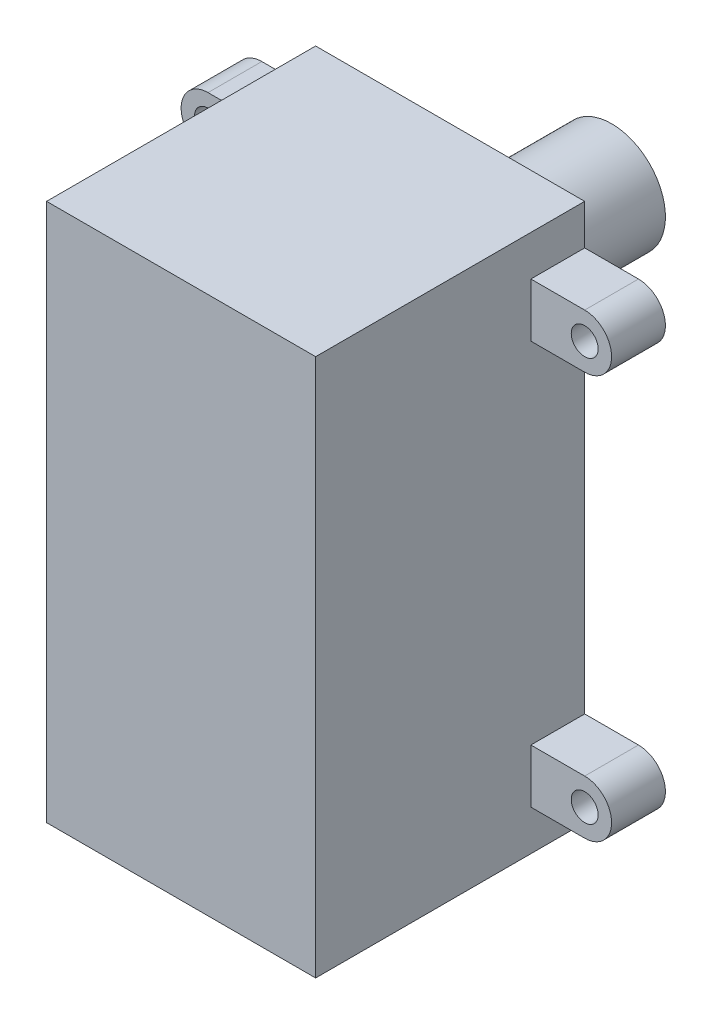
ISO-10303-21;
HEADER;
FILE_DESCRIPTION(('STEP AP214'),'2;1');
FILE_NAME('part.step','',(''),(''),'','','');
FILE_SCHEMA(('AUTOMOTIVE_DESIGN { 1 0 10303 214 1 1 1 1 }'));
ENDSEC;
DATA;
#1=APPLICATION_CONTEXT('core data for automotive mechanical design processes');
#2=APPLICATION_PROTOCOL_DEFINITION('international standard','automotive_design',2000,#1);
#3=PRODUCT_CONTEXT('',#1,'mechanical');
#4=PRODUCT('Part','Part','',(#3));
#5=PRODUCT_RELATED_PRODUCT_CATEGORY('part','',(#4));
#6=PRODUCT_DEFINITION_FORMATION('','',#4);
#7=PRODUCT_DEFINITION_CONTEXT('part definition',#1,'design');
#8=PRODUCT_DEFINITION('design','',#6,#7);
#9=PRODUCT_DEFINITION_SHAPE('','',#8);
#10=(LENGTH_UNIT() NAMED_UNIT(*) SI_UNIT(.MILLI.,.METRE.));
#11=(NAMED_UNIT(*) PLANE_ANGLE_UNIT() SI_UNIT($,.RADIAN.));
#12=(NAMED_UNIT(*) SI_UNIT($,.STERADIAN.) SOLID_ANGLE_UNIT());
#13=UNCERTAINTY_MEASURE_WITH_UNIT(LENGTH_MEASURE(1.E-05),#10,'distance_accuracy_value','');
#14=(GEOMETRIC_REPRESENTATION_CONTEXT(3) GLOBAL_UNCERTAINTY_ASSIGNED_CONTEXT((#13)) GLOBAL_UNIT_ASSIGNED_CONTEXT((#10,
#11,#12)) REPRESENTATION_CONTEXT('',''));
#15=CARTESIAN_POINT('',(0.,0.,0.));
#16=DIRECTION('',(0.,0.,1.));
#17=DIRECTION('',(1.,0.,0.));
#18=AXIS2_PLACEMENT_3D('',#15,#16,#17);
#19=CARTESIAN_POINT('',(-3.29383886255924,-5.,50.));
#20=DIRECTION('',(1.,0.,0.));
#21=DIRECTION('',(0.,0.,-1.));
#22=AXIS2_PLACEMENT_3D('',#19,#20,#21);
#23=PLANE('',#22);
#24=DIRECTION('',(0.,0.,-1.));
#25=VECTOR('',#24,1.);
#26=CARTESIAN_POINT('',(-3.29383886255924,87.5,10.));
#27=LINE('',#26,#25);
#28=CARTESIAN_POINT('',(-3.29383886255924,87.5,10.));
#29=VERTEX_POINT('',#28);
#30=CARTESIAN_POINT('',(-3.29383886255924,87.5,0.));
#31=VERTEX_POINT('',#30);
#32=EDGE_CURVE('E372',#29,#31,#27,.T.);
#33=ORIENTED_EDGE('',*,*,#32,.F.);
#34=DIRECTION('',(0.,-1.,0.));
#35=VECTOR('',#34,1.);
#36=CARTESIAN_POINT('',(-3.29383886255924,77.5,10.));
#37=LINE('',#36,#35);
#38=CARTESIAN_POINT('',(-3.29383886255924,77.5,10.));
#39=VERTEX_POINT('',#38);
#40=EDGE_CURVE('E214',#29,#39,#37,.T.);
#41=ORIENTED_EDGE('',*,*,#40,.T.);
#42=DIRECTION('',(0.,0.,-1.));
#43=VECTOR('',#42,1.);
#44=CARTESIAN_POINT('',(-3.29383886255924,77.5,10.));
#45=LINE('',#44,#43);
#46=CARTESIAN_POINT('',(-3.29383886255924,77.5,0.));
#47=VERTEX_POINT('',#46);
#48=EDGE_CURVE('E189',#39,#47,#45,.T.);
#49=ORIENTED_EDGE('',*,*,#48,.T.);
#50=DIRECTION('',(0.,-1.,0.));
#51=VECTOR('',#50,1.);
#52=CARTESIAN_POINT('',(-3.29383886255924,-5.,0.));
#53=LINE('',#52,#51);
#54=CARTESIAN_POINT('',(-3.29383886255924,12.5,0.));
#55=VERTEX_POINT('',#54);
#56=EDGE_CURVE('E206',#47,#55,#53,.T.);
#57=ORIENTED_EDGE('',*,*,#56,.T.);
#58=DIRECTION('',(0.,0.,-1.));
#59=VECTOR('',#58,1.);
#60=CARTESIAN_POINT('',(-3.29383886255924,12.5,10.));
#61=LINE('',#60,#59);
#62=CARTESIAN_POINT('',(-3.29383886255924,12.5,10.));
#63=VERTEX_POINT('',#62);
#64=EDGE_CURVE('E325',#63,#55,#61,.T.);
#65=ORIENTED_EDGE('',*,*,#64,.F.);
#66=DIRECTION('',(0.,-1.,0.));
#67=VECTOR('',#66,1.);
#68=CARTESIAN_POINT('',(-3.29383886255924,12.5,10.));
#69=LINE('',#68,#67);
#70=CARTESIAN_POINT('',(-3.29383886255924,2.5,10.));
#71=VERTEX_POINT('',#70);
#72=EDGE_CURVE('E301',#63,#71,#69,.T.);
#73=ORIENTED_EDGE('',*,*,#72,.T.);
#74=DIRECTION('',(0.,0.,-1.));
#75=VECTOR('',#74,1.);
#76=CARTESIAN_POINT('',(-3.29383886255924,2.5,10.));
#77=LINE('',#76,#75);
#78=CARTESIAN_POINT('',(-3.29383886255924,2.5,0.));
#79=VERTEX_POINT('',#78);
#80=EDGE_CURVE('E316',#71,#79,#77,.T.);
#81=ORIENTED_EDGE('',*,*,#80,.T.);
#82=CARTESIAN_POINT('',(-3.29383886255924,-5.,0.));
#83=VERTEX_POINT('',#82);
#84=EDGE_CURVE('E341',#79,#83,#53,.T.);
#85=ORIENTED_EDGE('',*,*,#84,.T.);
#86=DIRECTION('',(0.,0.,-1.));
#87=VECTOR('',#86,1.);
#88=CARTESIAN_POINT('',(-3.29383886255924,-5.,50.));
#89=LINE('',#88,#87);
#90=CARTESIAN_POINT('',(-3.29383886255924,-5.,50.));
#91=VERTEX_POINT('',#90);
#92=EDGE_CURVE('E360',#91,#83,#89,.T.);
#93=ORIENTED_EDGE('',*,*,#92,.F.);
#94=DIRECTION('',(0.,-1.,0.));
#95=VECTOR('',#94,1.);
#96=CARTESIAN_POINT('',(-3.29383886255924,-5.,50.));
#97=LINE('',#96,#95);
#98=CARTESIAN_POINT('',(-3.29383886255924,95.,50.));
#99=VERTEX_POINT('',#98);
#100=EDGE_CURVE('E334',#99,#91,#97,.T.);
#101=ORIENTED_EDGE('',*,*,#100,.F.);
#102=DIRECTION('',(0.,0.,-1.));
#103=VECTOR('',#102,1.);
#104=CARTESIAN_POINT('',(-3.29383886255924,95.,50.));
#105=LINE('',#104,#103);
#106=CARTESIAN_POINT('',(-3.29383886255924,95.,0.));
#107=VERTEX_POINT('',#106);
#108=EDGE_CURVE('E50',#99,#107,#105,.T.);
#109=ORIENTED_EDGE('',*,*,#108,.T.);
#110=EDGE_CURVE('E342',#107,#31,#53,.T.);
#111=ORIENTED_EDGE('',*,*,#110,.T.);
#112=EDGE_LOOP('',(#33,#41,#49,#57,#65,#73,#81,#85,#93,#101,#109,#111));
#113=FACE_BOUND('',#112,.T.);
#114=ADVANCED_FACE('F43',(#113),#23,.F.);
#115=CARTESIAN_POINT('',(46.7061611374408,-5.,50.));
#116=DIRECTION('',(-1.,0.,0.));
#117=DIRECTION('',(0.,0.,1.));
#118=AXIS2_PLACEMENT_3D('',#115,#116,#117);
#119=PLANE('',#118);
#120=DIRECTION('',(0.,0.,-1.));
#121=VECTOR('',#120,1.);
#122=CARTESIAN_POINT('',(46.7061611374408,2.5,10.));
#123=LINE('',#122,#121);
#124=CARTESIAN_POINT('',(46.7061611374408,2.5,10.));
#125=VERTEX_POINT('',#124);
#126=CARTESIAN_POINT('',(46.7061611374408,2.5,0.));
#127=VERTEX_POINT('',#126);
#128=EDGE_CURVE('E264',#125,#127,#123,.T.);
#129=ORIENTED_EDGE('',*,*,#128,.F.);
#130=DIRECTION('',(0.,1.,0.));
#131=VECTOR('',#130,1.);
#132=CARTESIAN_POINT('',(46.7061611374408,12.5,10.));
#133=LINE('',#132,#131);
#134=CARTESIAN_POINT('',(46.7061611374408,12.5,10.));
#135=VERTEX_POINT('',#134);
#136=EDGE_CURVE('E288',#125,#135,#133,.T.);
#137=ORIENTED_EDGE('',*,*,#136,.T.);
#138=DIRECTION('',(0.,0.,-1.));
#139=VECTOR('',#138,1.);
#140=CARTESIAN_POINT('',(46.7061611374408,12.5,10.));
#141=LINE('',#140,#139);
#142=CARTESIAN_POINT('',(46.7061611374408,12.5,0.));
#143=VERTEX_POINT('',#142);
#144=EDGE_CURVE('E270',#135,#143,#141,.T.);
#145=ORIENTED_EDGE('',*,*,#144,.T.);
#146=DIRECTION('',(0.,1.,0.));
#147=VECTOR('',#146,1.);
#148=CARTESIAN_POINT('',(46.7061611374408,-5.,0.));
#149=LINE('',#148,#147);
#150=CARTESIAN_POINT('',(46.7061611374408,77.5,0.));
#151=VERTEX_POINT('',#150);
#152=EDGE_CURVE('E354',#143,#151,#149,.T.);
#153=ORIENTED_EDGE('',*,*,#152,.T.);
#154=DIRECTION('',(0.,0.,-1.));
#155=VECTOR('',#154,1.);
#156=CARTESIAN_POINT('',(46.7061611374408,77.5,10.));
#157=LINE('',#156,#155);
#158=CARTESIAN_POINT('',(46.7061611374408,77.5,10.));
#159=VERTEX_POINT('',#158);
#160=EDGE_CURVE('E226',#159,#151,#157,.T.);
#161=ORIENTED_EDGE('',*,*,#160,.F.);
#162=DIRECTION('',(0.,1.,0.));
#163=VECTOR('',#162,1.);
#164=CARTESIAN_POINT('',(46.7061611374408,77.5,10.));
#165=LINE('',#164,#163);
#166=CARTESIAN_POINT('',(46.7061611374408,87.5,10.));
#167=VERTEX_POINT('',#166);
#168=EDGE_CURVE('E249',#159,#167,#165,.T.);
#169=ORIENTED_EDGE('',*,*,#168,.T.);
#170=DIRECTION('',(0.,0.,-1.));
#171=VECTOR('',#170,1.);
#172=CARTESIAN_POINT('',(46.7061611374408,87.5,10.));
#173=LINE('',#172,#171);
#174=CARTESIAN_POINT('',(46.7061611374408,87.5,0.));
#175=VERTEX_POINT('',#174);
#176=EDGE_CURVE('E233',#167,#175,#173,.T.);
#177=ORIENTED_EDGE('',*,*,#176,.T.);
#178=CARTESIAN_POINT('',(46.7061611374408,95.,0.));
#179=VERTEX_POINT('',#178);
#180=EDGE_CURVE('E349',#175,#179,#149,.T.);
#181=ORIENTED_EDGE('',*,*,#180,.T.);
#182=DIRECTION('',(0.,0.,-1.));
#183=VECTOR('',#182,1.);
#184=CARTESIAN_POINT('',(46.7061611374408,95.,50.));
#185=LINE('',#184,#183);
#186=CARTESIAN_POINT('',(46.7061611374408,95.,50.));
#187=VERTEX_POINT('',#186);
#188=EDGE_CURVE('E338',#187,#179,#185,.T.);
#189=ORIENTED_EDGE('',*,*,#188,.F.);
#190=DIRECTION('',(0.,1.,0.));
#191=VECTOR('',#190,1.);
#192=CARTESIAN_POINT('',(46.7061611374408,-5.,50.));
#193=LINE('',#192,#191);
#194=CARTESIAN_POINT('',(46.7061611374408,-5.,50.));
#195=VERTEX_POINT('',#194);
#196=EDGE_CURVE('E340',#195,#187,#193,.T.);
#197=ORIENTED_EDGE('',*,*,#196,.F.);
#198=DIRECTION('',(0.,0.,-1.));
#199=VECTOR('',#198,1.);
#200=CARTESIAN_POINT('',(46.7061611374408,-5.,50.));
#201=LINE('',#200,#199);
#202=CARTESIAN_POINT('',(46.7061611374408,-5.,0.));
#203=VERTEX_POINT('',#202);
#204=EDGE_CURVE('E353',#195,#203,#201,.T.);
#205=ORIENTED_EDGE('',*,*,#204,.T.);
#206=EDGE_CURVE('E331',#203,#127,#149,.T.);
#207=ORIENTED_EDGE('',*,*,#206,.T.);
#208=EDGE_LOOP('',(#129,#137,#145,#153,#161,#169,#177,#181,#189,#197,#205,#207));
#209=FACE_BOUND('',#208,.T.);
#210=ADVANCED_FACE('F410',(#209),#119,.F.);
#211=CARTESIAN_POINT('',(46.7061611374408,95.,50.));
#212=DIRECTION('',(0.,-1.,0.));
#213=DIRECTION('',(0.,0.,-1.));
#214=AXIS2_PLACEMENT_3D('',#211,#212,#213);
#215=PLANE('',#214);
#216=DIRECTION('',(-1.,0.,0.));
#217=VECTOR('',#216,1.);
#218=CARTESIAN_POINT('',(46.7061611374408,95.,0.));
#219=LINE('',#218,#217);
#220=EDGE_CURVE('E322',#179,#107,#219,.T.);
#221=ORIENTED_EDGE('',*,*,#220,.T.);
#222=ORIENTED_EDGE('',*,*,#108,.F.);
#223=DIRECTION('',(-1.,0.,0.));
#224=VECTOR('',#223,1.);
#225=CARTESIAN_POINT('',(46.7061611374408,95.,50.));
#226=LINE('',#225,#224);
#227=EDGE_CURVE('E329',#187,#99,#226,.T.);
#228=ORIENTED_EDGE('',*,*,#227,.F.);
#229=ORIENTED_EDGE('',*,*,#188,.T.);
#230=EDGE_LOOP('',(#221,#222,#228,#229));
#231=FACE_BOUND('',#230,.T.);
#232=ADVANCED_FACE('F44',(#231),#215,.F.);
#233=CARTESIAN_POINT('',(46.7061611374408,-5.,50.));
#234=DIRECTION('',(0.,1.,0.));
#235=DIRECTION('',(0.,0.,1.));
#236=AXIS2_PLACEMENT_3D('',#233,#234,#235);
#237=PLANE('',#236);
#238=DIRECTION('',(1.,0.,0.));
#239=VECTOR('',#238,1.);
#240=CARTESIAN_POINT('',(46.7061611374408,-5.,0.));
#241=LINE('',#240,#239);
#242=EDGE_CURVE('E350',#83,#203,#241,.T.);
#243=ORIENTED_EDGE('',*,*,#242,.T.);
#244=ORIENTED_EDGE('',*,*,#204,.F.);
#245=DIRECTION('',(1.,0.,0.));
#246=VECTOR('',#245,1.);
#247=CARTESIAN_POINT('',(46.7061611374408,-5.,50.));
#248=LINE('',#247,#246);
#249=EDGE_CURVE('E337',#91,#195,#248,.T.);
#250=ORIENTED_EDGE('',*,*,#249,.F.);
#251=ORIENTED_EDGE('',*,*,#92,.T.);
#252=EDGE_LOOP('',(#243,#244,#250,#251));
#253=FACE_BOUND('',#252,.T.);
#254=ADVANCED_FACE('F401',(#253),#237,.F.);
#255=CARTESIAN_POINT('',(0.,0.,50.));
#256=DIRECTION('',(0.,0.,-1.));
#257=DIRECTION('',(-1.,0.,0.));
#258=AXIS2_PLACEMENT_3D('',#255,#256,#257);
#259=PLANE('',#258);
#260=ORIENTED_EDGE('',*,*,#227,.T.);
#261=ORIENTED_EDGE('',*,*,#100,.T.);
#262=ORIENTED_EDGE('',*,*,#249,.T.);
#263=ORIENTED_EDGE('',*,*,#196,.T.);
#264=EDGE_LOOP('',(#260,#261,#262,#263));
#265=FACE_BOUND('',#264,.T.);
#266=ADVANCED_FACE('F394',(#265),#259,.F.);
#267=CARTESIAN_POINT('',(0.,0.,0.));
#268=DIRECTION('',(0.,0.,-1.));
#269=DIRECTION('',(-1.,0.,0.));
#270=AXIS2_PLACEMENT_3D('',#267,#268,#269);
#271=PLANE('',#270);
#272=CARTESIAN_POINT('',(21.7061611374408,70.,0.));
#273=DIRECTION('',(0.,0.,-1.));
#274=DIRECTION('',(-1.,0.,0.));
#275=AXIS2_PLACEMENT_3D('',#272,#273,#274);
#276=CIRCLE('',#275,10.);
#277=CARTESIAN_POINT('',(11.7061611374408,70.,0.));
#278=VERTEX_POINT('',#277);
#279=EDGE_CURVE('E11',#278,#278,#276,.T.);
#280=ORIENTED_EDGE('',*,*,#279,.F.);
#281=EDGE_LOOP('',(#280));
#282=FACE_BOUND('',#281,.T.);
#283=ORIENTED_EDGE('',*,*,#220,.F.);
#284=ORIENTED_EDGE('',*,*,#180,.F.);
#285=DIRECTION('',(1.,0.,0.));
#286=VECTOR('',#285,1.);
#287=CARTESIAN_POINT('',(46.7061611374408,87.5,0.));
#288=LINE('',#287,#286);
#289=CARTESIAN_POINT('',(56.7061611374408,87.5,0.));
#290=VERTEX_POINT('',#289);
#291=EDGE_CURVE('E240',#175,#290,#288,.T.);
#292=ORIENTED_EDGE('',*,*,#291,.T.);
#293=CARTESIAN_POINT('',(56.7061611374408,82.5,0.));
#294=DIRECTION('',(0.,0.,-1.));
#295=DIRECTION('',(-1.,0.,0.));
#296=AXIS2_PLACEMENT_3D('',#293,#294,#295);
#297=CIRCLE('',#296,5.);
#298=CARTESIAN_POINT('',(56.7061611374408,77.5,0.));
#299=VERTEX_POINT('',#298);
#300=EDGE_CURVE('E241',#290,#299,#297,.T.);
#301=ORIENTED_EDGE('',*,*,#300,.T.);
#302=DIRECTION('',(-1.,0.,0.));
#303=VECTOR('',#302,1.);
#304=CARTESIAN_POINT('',(56.7061611374408,77.5,0.));
#305=LINE('',#304,#303);
#306=EDGE_CURVE('E238',#299,#151,#305,.T.);
#307=ORIENTED_EDGE('',*,*,#306,.T.);
#308=ORIENTED_EDGE('',*,*,#152,.F.);
#309=DIRECTION('',(1.,0.,0.));
#310=VECTOR('',#309,1.);
#311=CARTESIAN_POINT('',(56.7061611374408,12.5,0.));
#312=LINE('',#311,#310);
#313=CARTESIAN_POINT('',(56.7061611374408,12.5,0.));
#314=VERTEX_POINT('',#313);
#315=EDGE_CURVE('E272',#143,#314,#312,.T.);
#316=ORIENTED_EDGE('',*,*,#315,.T.);
#317=CARTESIAN_POINT('',(56.7061611374408,7.5,0.));
#318=DIRECTION('',(0.,0.,-1.));
#319=DIRECTION('',(1.,0.,0.));
#320=AXIS2_PLACEMENT_3D('',#317,#318,#319);
#321=CIRCLE('',#320,5.);
#322=CARTESIAN_POINT('',(56.7061611374408,2.5,0.));
#323=VERTEX_POINT('',#322);
#324=EDGE_CURVE('E278',#314,#323,#321,.T.);
#325=ORIENTED_EDGE('',*,*,#324,.T.);
#326=DIRECTION('',(-1.,0.,0.));
#327=VECTOR('',#326,1.);
#328=CARTESIAN_POINT('',(46.7061611374408,2.5,0.));
#329=LINE('',#328,#327);
#330=EDGE_CURVE('E277',#323,#127,#329,.T.);
#331=ORIENTED_EDGE('',*,*,#330,.T.);
#332=ORIENTED_EDGE('',*,*,#206,.F.);
#333=ORIENTED_EDGE('',*,*,#242,.F.);
#334=ORIENTED_EDGE('',*,*,#84,.F.);
#335=DIRECTION('',(-1.,0.,0.));
#336=VECTOR('',#335,1.);
#337=CARTESIAN_POINT('',(-3.29383886255924,2.5,0.));
#338=LINE('',#337,#336);
#339=CARTESIAN_POINT('',(-13.2938388625592,2.5,0.));
#340=VERTEX_POINT('',#339);
#341=EDGE_CURVE('E56',#79,#340,#338,.T.);
#342=ORIENTED_EDGE('',*,*,#341,.T.);
#343=CARTESIAN_POINT('',(-13.2938388625592,7.5,0.));
#344=DIRECTION('',(0.,0.,-1.));
#345=DIRECTION('',(-1.,0.,0.));
#346=AXIS2_PLACEMENT_3D('',#343,#344,#345);
#347=CIRCLE('',#346,5.);
#348=CARTESIAN_POINT('',(-13.2938388625592,12.5,0.));
#349=VERTEX_POINT('',#348);
#350=EDGE_CURVE('E318',#340,#349,#347,.T.);
#351=ORIENTED_EDGE('',*,*,#350,.T.);
#352=DIRECTION('',(1.,0.,0.));
#353=VECTOR('',#352,1.);
#354=CARTESIAN_POINT('',(-13.2938388625592,12.5,0.));
#355=LINE('',#354,#353);
#356=EDGE_CURVE('E307',#349,#55,#355,.T.);
#357=ORIENTED_EDGE('',*,*,#356,.T.);
#358=ORIENTED_EDGE('',*,*,#56,.F.);
#359=DIRECTION('',(-1.,0.,0.));
#360=VECTOR('',#359,1.);
#361=CARTESIAN_POINT('',(-13.2938388625592,77.5,0.));
#362=LINE('',#361,#360);
#363=CARTESIAN_POINT('',(-13.2938388625592,77.5,0.));
#364=VERTEX_POINT('',#363);
#365=EDGE_CURVE('E70',#47,#364,#362,.T.);
#366=ORIENTED_EDGE('',*,*,#365,.T.);
#367=CARTESIAN_POINT('',(-13.2938388625592,82.5,0.));
#368=DIRECTION('',(0.,0.,-1.));
#369=DIRECTION('',(1.,0.,0.));
#370=AXIS2_PLACEMENT_3D('',#367,#368,#369);
#371=CIRCLE('',#370,5.);
#372=CARTESIAN_POINT('',(-13.2938388625592,87.5,0.));
#373=VERTEX_POINT('',#372);
#374=EDGE_CURVE('E193',#364,#373,#371,.T.);
#375=ORIENTED_EDGE('',*,*,#374,.T.);
#376=DIRECTION('',(1.,0.,0.));
#377=VECTOR('',#376,1.);
#378=CARTESIAN_POINT('',(-3.29383886255924,87.5,0.));
#379=LINE('',#378,#377);
#380=EDGE_CURVE('E196',#373,#31,#379,.T.);
#381=ORIENTED_EDGE('',*,*,#380,.T.);
#382=ORIENTED_EDGE('',*,*,#110,.F.);
#383=EDGE_LOOP('',(#283,#284,#292,#301,#307,#308,#316,#325,#331,#332,#333,#334,#342,#351,#357,
#358,#366,#375,#381,#382));
#384=FACE_BOUND('',#383,.T.);
#385=CARTESIAN_POINT('',(56.7061611374408,82.5,0.));
#386=DIRECTION('',(0.,0.,-1.));
#387=DIRECTION('',(-1.,0.,0.));
#388=AXIS2_PLACEMENT_3D('',#385,#386,#387);
#389=CIRCLE('',#388,2.5);
#390=CARTESIAN_POINT('',(54.2061611374408,82.5,0.));
#391=VERTEX_POINT('',#390);
#392=EDGE_CURVE('E190',#391,#391,#389,.T.);
#393=ORIENTED_EDGE('',*,*,#392,.F.);
#394=EDGE_LOOP('',(#393));
#395=FACE_BOUND('',#394,.T.);
#396=CARTESIAN_POINT('',(56.7061611374408,7.5,0.));
#397=DIRECTION('',(0.,0.,-1.));
#398=DIRECTION('',(1.,0.,0.));
#399=AXIS2_PLACEMENT_3D('',#396,#397,#398);
#400=CIRCLE('',#399,2.5);
#401=CARTESIAN_POINT('',(59.2061611374408,7.5,0.));
#402=VERTEX_POINT('',#401);
#403=EDGE_CURVE('E237',#402,#402,#400,.T.);
#404=ORIENTED_EDGE('',*,*,#403,.F.);
#405=EDGE_LOOP('',(#404));
#406=FACE_BOUND('',#405,.T.);
#407=CARTESIAN_POINT('',(-13.2938388625592,7.5,0.));
#408=DIRECTION('',(0.,0.,-1.));
#409=DIRECTION('',(-1.,0.,0.));
#410=AXIS2_PLACEMENT_3D('',#407,#408,#409);
#411=CIRCLE('',#410,2.5);
#412=CARTESIAN_POINT('',(-15.7938388625592,7.5,0.));
#413=VERTEX_POINT('',#412);
#414=EDGE_CURVE('E224',#413,#413,#411,.T.);
#415=ORIENTED_EDGE('',*,*,#414,.F.);
#416=EDGE_LOOP('',(#415));
#417=FACE_BOUND('',#416,.T.);
#418=CARTESIAN_POINT('',(-13.2938388625592,82.5,0.));
#419=DIRECTION('',(0.,0.,-1.));
#420=DIRECTION('',(1.,0.,0.));
#421=AXIS2_PLACEMENT_3D('',#418,#419,#420);
#422=CIRCLE('',#421,2.5);
#423=CARTESIAN_POINT('',(-10.7938388625592,82.5,0.));
#424=VERTEX_POINT('',#423);
#425=EDGE_CURVE('E219',#424,#424,#422,.T.);
#426=ORIENTED_EDGE('',*,*,#425,.F.);
#427=EDGE_LOOP('',(#426));
#428=FACE_BOUND('',#427,.T.);
#429=ADVANCED_FACE('F205',(#282,#384,#395,#406,#417,#428),#271,.T.);
#430=CARTESIAN_POINT('',(56.7061611374408,82.5,10.));
#431=DIRECTION('',(0.,0.,-1.));
#432=DIRECTION('',(-1.,0.,0.));
#433=AXIS2_PLACEMENT_3D('',#430,#431,#432);
#434=CYLINDRICAL_SURFACE('',#433,5.);
#435=ORIENTED_EDGE('',*,*,#300,.F.);
#436=DIRECTION('',(0.,0.,-1.));
#437=VECTOR('',#436,1.);
#438=CARTESIAN_POINT('',(56.7061611374408,87.5,10.));
#439=LINE('',#438,#437);
#440=CARTESIAN_POINT('',(56.7061611374408,87.5,10.));
#441=VERTEX_POINT('',#440);
#442=EDGE_CURVE('E232',#441,#290,#439,.T.);
#443=ORIENTED_EDGE('',*,*,#442,.F.);
#444=CARTESIAN_POINT('',(56.7061611374408,82.5,10.));
#445=DIRECTION('',(0.,0.,-1.));
#446=DIRECTION('',(-1.,0.,0.));
#447=AXIS2_PLACEMENT_3D('',#444,#445,#446);
#448=CIRCLE('',#447,5.);
#449=CARTESIAN_POINT('',(56.7061611374408,77.5,10.));
#450=VERTEX_POINT('',#449);
#451=EDGE_CURVE('E242',#441,#450,#448,.T.);
#452=ORIENTED_EDGE('',*,*,#451,.T.);
#453=DIRECTION('',(0.,0.,-1.));
#454=VECTOR('',#453,1.);
#455=CARTESIAN_POINT('',(56.7061611374408,77.5,10.));
#456=LINE('',#455,#454);
#457=EDGE_CURVE('E227',#450,#299,#456,.T.);
#458=ORIENTED_EDGE('',*,*,#457,.T.);
#459=EDGE_LOOP('',(#435,#443,#452,#458));
#460=FACE_BOUND('',#459,.T.);
#461=ADVANCED_FACE('F392',(#460),#434,.T.);
#462=CARTESIAN_POINT('',(46.7061611374408,87.5,10.));
#463=DIRECTION('',(0.,1.,0.));
#464=DIRECTION('',(0.,0.,1.));
#465=AXIS2_PLACEMENT_3D('',#462,#463,#464);
#466=PLANE('',#465);
#467=ORIENTED_EDGE('',*,*,#291,.F.);
#468=ORIENTED_EDGE('',*,*,#176,.F.);
#469=DIRECTION('',(1.,0.,0.));
#470=VECTOR('',#469,1.);
#471=CARTESIAN_POINT('',(46.7061611374408,87.5,10.));
#472=LINE('',#471,#470);
#473=EDGE_CURVE('E230',#167,#441,#472,.T.);
#474=ORIENTED_EDGE('',*,*,#473,.T.);
#475=ORIENTED_EDGE('',*,*,#442,.T.);
#476=EDGE_LOOP('',(#467,#468,#474,#475));
#477=FACE_BOUND('',#476,.T.);
#478=ADVANCED_FACE('F397',(#477),#466,.T.);
#479=CARTESIAN_POINT('',(56.7061611374408,77.5,10.));
#480=DIRECTION('',(0.,-1.,0.));
#481=DIRECTION('',(0.,0.,-1.));
#482=AXIS2_PLACEMENT_3D('',#479,#480,#481);
#483=PLANE('',#482);
#484=ORIENTED_EDGE('',*,*,#306,.F.);
#485=ORIENTED_EDGE('',*,*,#457,.F.);
#486=DIRECTION('',(-1.,0.,0.));
#487=VECTOR('',#486,1.);
#488=CARTESIAN_POINT('',(56.7061611374408,77.5,10.));
#489=LINE('',#488,#487);
#490=EDGE_CURVE('E251',#450,#159,#489,.T.);
#491=ORIENTED_EDGE('',*,*,#490,.T.);
#492=ORIENTED_EDGE('',*,*,#160,.T.);
#493=EDGE_LOOP('',(#484,#485,#491,#492));
#494=FACE_BOUND('',#493,.T.);
#495=ADVANCED_FACE('F447',(#494),#483,.T.);
#496=CARTESIAN_POINT('',(56.7061611374408,82.5,10.));
#497=DIRECTION('',(0.,0.,-1.));
#498=DIRECTION('',(-1.,0.,0.));
#499=AXIS2_PLACEMENT_3D('',#496,#497,#498);
#500=PLANE('',#499);
#501=CARTESIAN_POINT('',(56.7061611374408,82.5,10.));
#502=DIRECTION('',(0.,0.,-1.));
#503=DIRECTION('',(-1.,0.,0.));
#504=AXIS2_PLACEMENT_3D('',#501,#502,#503);
#505=CIRCLE('',#504,2.5);
#506=CARTESIAN_POINT('',(54.2061611374408,82.5,10.));
#507=VERTEX_POINT('',#506);
#508=EDGE_CURVE('E250',#507,#507,#505,.T.);
#509=ORIENTED_EDGE('',*,*,#508,.T.);
#510=EDGE_LOOP('',(#509));
#511=FACE_BOUND('',#510,.T.);
#512=ORIENTED_EDGE('',*,*,#451,.F.);
#513=ORIENTED_EDGE('',*,*,#473,.F.);
#514=ORIENTED_EDGE('',*,*,#168,.F.);
#515=ORIENTED_EDGE('',*,*,#490,.F.);
#516=EDGE_LOOP('',(#512,#513,#514,#515));
#517=FACE_BOUND('',#516,.T.);
#518=ADVANCED_FACE('F445',(#511,#517),#500,.F.);
#519=CARTESIAN_POINT('',(56.7061611374408,82.5,10.));
#520=DIRECTION('',(0.,0.,-1.));
#521=DIRECTION('',(-1.,0.,0.));
#522=AXIS2_PLACEMENT_3D('',#519,#520,#521);
#523=CYLINDRICAL_SURFACE('',#522,2.5);
#524=ORIENTED_EDGE('',*,*,#508,.F.);
#525=EDGE_LOOP('',(#524));
#526=FACE_BOUND('',#525,.T.);
#527=ORIENTED_EDGE('',*,*,#392,.T.);
#528=EDGE_LOOP('',(#527));
#529=FACE_BOUND('',#528,.T.);
#530=ADVANCED_FACE('F451',(#526,#529),#523,.F.);
#531=CARTESIAN_POINT('',(56.7061611374408,7.5,10.));
#532=DIRECTION('',(0.,0.,-1.));
#533=DIRECTION('',(-1.,0.,0.));
#534=AXIS2_PLACEMENT_3D('',#531,#532,#533);
#535=CYLINDRICAL_SURFACE('',#534,5.);
#536=ORIENTED_EDGE('',*,*,#324,.F.);
#537=DIRECTION('',(0.,0.,-1.));
#538=VECTOR('',#537,1.);
#539=CARTESIAN_POINT('',(56.7061611374408,12.5,10.));
#540=LINE('',#539,#538);
#541=CARTESIAN_POINT('',(56.7061611374408,12.5,10.));
#542=VERTEX_POINT('',#541);
#543=EDGE_CURVE('E269',#542,#314,#540,.T.);
#544=ORIENTED_EDGE('',*,*,#543,.F.);
#545=CARTESIAN_POINT('',(56.7061611374408,7.5,10.));
#546=DIRECTION('',(0.,0.,-1.));
#547=DIRECTION('',(1.,0.,0.));
#548=AXIS2_PLACEMENT_3D('',#545,#546,#547);
#549=CIRCLE('',#548,5.);
#550=CARTESIAN_POINT('',(56.7061611374408,2.5,10.));
#551=VERTEX_POINT('',#550);
#552=EDGE_CURVE('E280',#542,#551,#549,.T.);
#553=ORIENTED_EDGE('',*,*,#552,.T.);
#554=DIRECTION('',(0.,0.,-1.));
#555=VECTOR('',#554,1.);
#556=CARTESIAN_POINT('',(56.7061611374408,2.5,10.));
#557=LINE('',#556,#555);
#558=EDGE_CURVE('E265',#551,#323,#557,.T.);
#559=ORIENTED_EDGE('',*,*,#558,.T.);
#560=EDGE_LOOP('',(#536,#544,#553,#559));
#561=FACE_BOUND('',#560,.T.);
#562=ADVANCED_FACE('F462',(#561),#535,.T.);
#563=CARTESIAN_POINT('',(56.7061611374408,12.5,10.));
#564=DIRECTION('',(0.,1.,0.));
#565=DIRECTION('',(0.,0.,1.));
#566=AXIS2_PLACEMENT_3D('',#563,#564,#565);
#567=PLANE('',#566);
#568=ORIENTED_EDGE('',*,*,#315,.F.);
#569=ORIENTED_EDGE('',*,*,#144,.F.);
#570=DIRECTION('',(1.,0.,0.));
#571=VECTOR('',#570,1.);
#572=CARTESIAN_POINT('',(56.7061611374408,12.5,10.));
#573=LINE('',#572,#571);
#574=EDGE_CURVE('E262',#135,#542,#573,.T.);
#575=ORIENTED_EDGE('',*,*,#574,.T.);
#576=ORIENTED_EDGE('',*,*,#543,.T.);
#577=EDGE_LOOP('',(#568,#569,#575,#576));
#578=FACE_BOUND('',#577,.T.);
#579=ADVANCED_FACE('F434',(#578),#567,.T.);
#580=CARTESIAN_POINT('',(46.7061611374408,2.5,10.));
#581=DIRECTION('',(0.,-1.,0.));
#582=DIRECTION('',(1.,0.,0.));
#583=AXIS2_PLACEMENT_3D('',#580,#581,#582);
#584=PLANE('',#583);
#585=ORIENTED_EDGE('',*,*,#330,.F.);
#586=ORIENTED_EDGE('',*,*,#558,.F.);
#587=DIRECTION('',(-1.,0.,0.));
#588=VECTOR('',#587,1.);
#589=CARTESIAN_POINT('',(46.7061611374408,2.5,10.));
#590=LINE('',#589,#588);
#591=EDGE_CURVE('E287',#551,#125,#590,.T.);
#592=ORIENTED_EDGE('',*,*,#591,.T.);
#593=ORIENTED_EDGE('',*,*,#128,.T.);
#594=EDGE_LOOP('',(#585,#586,#592,#593));
#595=FACE_BOUND('',#594,.T.);
#596=ADVANCED_FACE('F426',(#595),#584,.T.);
#597=CARTESIAN_POINT('',(56.7061611374408,7.5,10.));
#598=DIRECTION('',(0.,0.,1.));
#599=DIRECTION('',(1.,0.,0.));
#600=AXIS2_PLACEMENT_3D('',#597,#598,#599);
#601=PLANE('',#600);
#602=CARTESIAN_POINT('',(56.7061611374408,7.5,10.));
#603=DIRECTION('',(0.,0.,-1.));
#604=DIRECTION('',(1.,0.,0.));
#605=AXIS2_PLACEMENT_3D('',#602,#603,#604);
#606=CIRCLE('',#605,2.5);
#607=CARTESIAN_POINT('',(59.2061611374408,7.5,10.));
#608=VERTEX_POINT('',#607);
#609=EDGE_CURVE('E285',#608,#608,#606,.T.);
#610=ORIENTED_EDGE('',*,*,#609,.T.);
#611=EDGE_LOOP('',(#610));
#612=FACE_BOUND('',#611,.T.);
#613=ORIENTED_EDGE('',*,*,#552,.F.);
#614=ORIENTED_EDGE('',*,*,#574,.F.);
#615=ORIENTED_EDGE('',*,*,#136,.F.);
#616=ORIENTED_EDGE('',*,*,#591,.F.);
#617=EDGE_LOOP('',(#613,#614,#615,#616));
#618=FACE_BOUND('',#617,.T.);
#619=ADVANCED_FACE('F433',(#612,#618),#601,.T.);
#620=CARTESIAN_POINT('',(56.7061611374408,7.5,10.));
#621=DIRECTION('',(0.,0.,-1.));
#622=DIRECTION('',(-1.,0.,0.));
#623=AXIS2_PLACEMENT_3D('',#620,#621,#622);
#624=CYLINDRICAL_SURFACE('',#623,2.5);
#625=ORIENTED_EDGE('',*,*,#609,.F.);
#626=EDGE_LOOP('',(#625));
#627=FACE_BOUND('',#626,.T.);
#628=ORIENTED_EDGE('',*,*,#403,.T.);
#629=EDGE_LOOP('',(#628));
#630=FACE_BOUND('',#629,.T.);
#631=ADVANCED_FACE('F472',(#627,#630),#624,.F.);
#632=CARTESIAN_POINT('',(-13.2938388625592,12.5,10.));
#633=DIRECTION('',(0.,1.,0.));
#634=DIRECTION('',(0.,0.,1.));
#635=AXIS2_PLACEMENT_3D('',#632,#633,#634);
#636=PLANE('',#635);
#637=ORIENTED_EDGE('',*,*,#356,.F.);
#638=DIRECTION('',(0.,0.,-1.));
#639=VECTOR('',#638,1.);
#640=CARTESIAN_POINT('',(-13.2938388625592,12.5,10.));
#641=LINE('',#640,#639);
#642=CARTESIAN_POINT('',(-13.2938388625592,12.5,10.));
#643=VERTEX_POINT('',#642);
#644=EDGE_CURVE('E324',#643,#349,#641,.T.);
#645=ORIENTED_EDGE('',*,*,#644,.F.);
#646=DIRECTION('',(1.,0.,0.));
#647=VECTOR('',#646,1.);
#648=CARTESIAN_POINT('',(-13.2938388625592,12.5,10.));
#649=LINE('',#648,#647);
#650=EDGE_CURVE('E311',#643,#63,#649,.T.);
#651=ORIENTED_EDGE('',*,*,#650,.T.);
#652=ORIENTED_EDGE('',*,*,#64,.T.);
#653=EDGE_LOOP('',(#637,#645,#651,#652));
#654=FACE_BOUND('',#653,.T.);
#655=ADVANCED_FACE('F478',(#654),#636,.T.);
#656=CARTESIAN_POINT('',(-13.2938388625592,7.5,10.));
#657=DIRECTION('',(0.,0.,-1.));
#658=DIRECTION('',(-1.,0.,0.));
#659=AXIS2_PLACEMENT_3D('',#656,#657,#658);
#660=CYLINDRICAL_SURFACE('',#659,5.);
#661=ORIENTED_EDGE('',*,*,#350,.F.);
#662=DIRECTION('',(0.,0.,-1.));
#663=VECTOR('',#662,1.);
#664=CARTESIAN_POINT('',(-13.2938388625592,2.5,10.));
#665=LINE('',#664,#663);
#666=CARTESIAN_POINT('',(-13.2938388625592,2.5,10.));
#667=VERTEX_POINT('',#666);
#668=EDGE_CURVE('E330',#667,#340,#665,.T.);
#669=ORIENTED_EDGE('',*,*,#668,.F.);
#670=CARTESIAN_POINT('',(-13.2938388625592,7.5,10.));
#671=DIRECTION('',(0.,0.,-1.));
#672=DIRECTION('',(-1.,0.,0.));
#673=AXIS2_PLACEMENT_3D('',#670,#671,#672);
#674=CIRCLE('',#673,5.);
#675=EDGE_CURVE('E309',#667,#643,#674,.T.);
#676=ORIENTED_EDGE('',*,*,#675,.T.);
#677=ORIENTED_EDGE('',*,*,#644,.T.);
#678=EDGE_LOOP('',(#661,#669,#676,#677));
#679=FACE_BOUND('',#678,.T.);
#680=ADVANCED_FACE('F487',(#679),#660,.T.);
#681=CARTESIAN_POINT('',(-3.29383886255924,2.5,10.));
#682=DIRECTION('',(0.,-1.,0.));
#683=DIRECTION('',(1.,0.,0.));
#684=AXIS2_PLACEMENT_3D('',#681,#682,#683);
#685=PLANE('',#684);
#686=ORIENTED_EDGE('',*,*,#341,.F.);
#687=ORIENTED_EDGE('',*,*,#80,.F.);
#688=DIRECTION('',(-1.,0.,0.));
#689=VECTOR('',#688,1.);
#690=CARTESIAN_POINT('',(-3.29383886255924,2.5,10.));
#691=LINE('',#690,#689);
#692=EDGE_CURVE('E308',#71,#667,#691,.T.);
#693=ORIENTED_EDGE('',*,*,#692,.T.);
#694=ORIENTED_EDGE('',*,*,#668,.T.);
#695=EDGE_LOOP('',(#686,#687,#693,#694));
#696=FACE_BOUND('',#695,.T.);
#697=ADVANCED_FACE('F484',(#696),#685,.T.);
#698=CARTESIAN_POINT('',(-13.2938388625592,7.5,10.));
#699=DIRECTION('',(0.,0.,-1.));
#700=DIRECTION('',(-1.,0.,0.));
#701=AXIS2_PLACEMENT_3D('',#698,#699,#700);
#702=PLANE('',#701);
#703=CARTESIAN_POINT('',(-13.2938388625592,7.5,10.));
#704=DIRECTION('',(0.,0.,-1.));
#705=DIRECTION('',(-1.,0.,0.));
#706=AXIS2_PLACEMENT_3D('',#703,#704,#705);
#707=CIRCLE('',#706,2.5);
#708=CARTESIAN_POINT('',(-15.7938388625592,7.5,10.));
#709=VERTEX_POINT('',#708);
#710=EDGE_CURVE('E300',#709,#709,#707,.T.);
#711=ORIENTED_EDGE('',*,*,#710,.T.);
#712=EDGE_LOOP('',(#711));
#713=FACE_BOUND('',#712,.T.);
#714=ORIENTED_EDGE('',*,*,#72,.F.);
#715=ORIENTED_EDGE('',*,*,#650,.F.);
#716=ORIENTED_EDGE('',*,*,#675,.F.);
#717=ORIENTED_EDGE('',*,*,#692,.F.);
#718=EDGE_LOOP('',(#714,#715,#716,#717));
#719=FACE_BOUND('',#718,.T.);
#720=ADVANCED_FACE('F481',(#713,#719),#702,.F.);
#721=CARTESIAN_POINT('',(-13.2938388625592,7.5,10.));
#722=DIRECTION('',(0.,0.,-1.));
#723=DIRECTION('',(-1.,0.,0.));
#724=AXIS2_PLACEMENT_3D('',#721,#722,#723);
#725=CYLINDRICAL_SURFACE('',#724,2.5);
#726=ORIENTED_EDGE('',*,*,#710,.F.);
#727=EDGE_LOOP('',(#726));
#728=FACE_BOUND('',#727,.T.);
#729=ORIENTED_EDGE('',*,*,#414,.T.);
#730=EDGE_LOOP('',(#729));
#731=FACE_BOUND('',#730,.T.);
#732=ADVANCED_FACE('F476',(#728,#731),#725,.F.);
#733=CARTESIAN_POINT('',(-13.2938388625592,82.5,10.));
#734=DIRECTION('',(0.,0.,-1.));
#735=DIRECTION('',(-1.,0.,0.));
#736=AXIS2_PLACEMENT_3D('',#733,#734,#735);
#737=CYLINDRICAL_SURFACE('',#736,5.);
#738=ORIENTED_EDGE('',*,*,#374,.F.);
#739=DIRECTION('',(0.,0.,-1.));
#740=VECTOR('',#739,1.);
#741=CARTESIAN_POINT('',(-13.2938388625592,77.5,10.));
#742=LINE('',#741,#740);
#743=CARTESIAN_POINT('',(-13.2938388625592,77.5,10.));
#744=VERTEX_POINT('',#743);
#745=EDGE_CURVE('E177',#744,#364,#742,.T.);
#746=ORIENTED_EDGE('',*,*,#745,.F.);
#747=CARTESIAN_POINT('',(-13.2938388625592,82.5,10.));
#748=DIRECTION('',(0.,0.,-1.));
#749=DIRECTION('',(1.,0.,0.));
#750=AXIS2_PLACEMENT_3D('',#747,#748,#749);
#751=CIRCLE('',#750,5.);
#752=CARTESIAN_POINT('',(-13.2938388625592,87.5,10.));
#753=VERTEX_POINT('',#752);
#754=EDGE_CURVE('E210',#744,#753,#751,.T.);
#755=ORIENTED_EDGE('',*,*,#754,.T.);
#756=DIRECTION('',(0.,0.,-1.));
#757=VECTOR('',#756,1.);
#758=CARTESIAN_POINT('',(-13.2938388625592,87.5,10.));
#759=LINE('',#758,#757);
#760=EDGE_CURVE('E191',#753,#373,#759,.T.);
#761=ORIENTED_EDGE('',*,*,#760,.T.);
#762=EDGE_LOOP('',(#738,#746,#755,#761));
#763=FACE_BOUND('',#762,.T.);
#764=ADVANCED_FACE('F195',(#763),#737,.T.);
#765=CARTESIAN_POINT('',(-13.2938388625592,77.5,10.));
#766=DIRECTION('',(0.,-1.,0.));
#767=DIRECTION('',(0.,0.,-1.));
#768=AXIS2_PLACEMENT_3D('',#765,#766,#767);
#769=PLANE('',#768);
#770=ORIENTED_EDGE('',*,*,#365,.F.);
#771=ORIENTED_EDGE('',*,*,#48,.F.);
#772=DIRECTION('',(-1.,0.,0.));
#773=VECTOR('',#772,1.);
#774=CARTESIAN_POINT('',(-13.2938388625592,77.5,10.));
#775=LINE('',#774,#773);
#776=EDGE_CURVE('E181',#39,#744,#775,.T.);
#777=ORIENTED_EDGE('',*,*,#776,.T.);
#778=ORIENTED_EDGE('',*,*,#745,.T.);
#779=EDGE_LOOP('',(#770,#771,#777,#778));
#780=FACE_BOUND('',#779,.T.);
#781=ADVANCED_FACE('F182',(#780),#769,.T.);
#782=CARTESIAN_POINT('',(-3.29383886255924,87.5,10.));
#783=DIRECTION('',(0.,1.,0.));
#784=DIRECTION('',(0.,0.,1.));
#785=AXIS2_PLACEMENT_3D('',#782,#783,#784);
#786=PLANE('',#785);
#787=ORIENTED_EDGE('',*,*,#380,.F.);
#788=ORIENTED_EDGE('',*,*,#760,.F.);
#789=DIRECTION('',(1.,0.,0.));
#790=VECTOR('',#789,1.);
#791=CARTESIAN_POINT('',(-3.29383886255924,87.5,10.));
#792=LINE('',#791,#790);
#793=EDGE_CURVE('E209',#753,#29,#792,.T.);
#794=ORIENTED_EDGE('',*,*,#793,.T.);
#795=ORIENTED_EDGE('',*,*,#32,.T.);
#796=EDGE_LOOP('',(#787,#788,#794,#795));
#797=FACE_BOUND('',#796,.T.);
#798=ADVANCED_FACE('F375',(#797),#786,.T.);
#799=CARTESIAN_POINT('',(-13.2938388625592,82.5,10.));
#800=DIRECTION('',(0.,0.,1.));
#801=DIRECTION('',(1.,0.,0.));
#802=AXIS2_PLACEMENT_3D('',#799,#800,#801);
#803=PLANE('',#802);
#804=CARTESIAN_POINT('',(-13.2938388625592,82.5,10.));
#805=DIRECTION('',(0.,0.,-1.));
#806=DIRECTION('',(1.,0.,0.));
#807=AXIS2_PLACEMENT_3D('',#804,#805,#806);
#808=CIRCLE('',#807,2.5);
#809=CARTESIAN_POINT('',(-10.7938388625592,82.5,10.));
#810=VERTEX_POINT('',#809);
#811=EDGE_CURVE('E197',#810,#810,#808,.T.);
#812=ORIENTED_EDGE('',*,*,#811,.T.);
#813=EDGE_LOOP('',(#812));
#814=FACE_BOUND('',#813,.T.);
#815=ORIENTED_EDGE('',*,*,#754,.F.);
#816=ORIENTED_EDGE('',*,*,#776,.F.);
#817=ORIENTED_EDGE('',*,*,#40,.F.);
#818=ORIENTED_EDGE('',*,*,#793,.F.);
#819=EDGE_LOOP('',(#815,#816,#817,#818));
#820=FACE_BOUND('',#819,.T.);
#821=ADVANCED_FACE('F529',(#814,#820),#803,.T.);
#822=CARTESIAN_POINT('',(-13.2938388625592,82.5,10.));
#823=DIRECTION('',(0.,0.,-1.));
#824=DIRECTION('',(-1.,0.,0.));
#825=AXIS2_PLACEMENT_3D('',#822,#823,#824);
#826=CYLINDRICAL_SURFACE('',#825,2.5);
#827=ORIENTED_EDGE('',*,*,#811,.F.);
#828=EDGE_LOOP('',(#827));
#829=FACE_BOUND('',#828,.T.);
#830=ORIENTED_EDGE('',*,*,#425,.T.);
#831=EDGE_LOOP('',(#830));
#832=FACE_BOUND('',#831,.T.);
#833=ADVANCED_FACE('F387',(#829,#832),#826,.F.);
#834=CARTESIAN_POINT('',(21.7061611374408,70.,-30.));
#835=DIRECTION('',(0.,0.,1.));
#836=DIRECTION('',(1.,0.,0.));
#837=AXIS2_PLACEMENT_3D('',#834,#835,#836);
#838=CYLINDRICAL_SURFACE('',#837,10.);
#839=CARTESIAN_POINT('',(21.7061611374408,70.,-30.));
#840=DIRECTION('',(0.,0.,-1.));
#841=DIRECTION('',(-1.,0.,0.));
#842=AXIS2_PLACEMENT_3D('',#839,#840,#841);
#843=CIRCLE('',#842,10.);
#844=CARTESIAN_POINT('',(11.7061611374408,70.,-30.));
#845=VERTEX_POINT('',#844);
#846=EDGE_CURVE('E275',#845,#845,#843,.T.);
#847=ORIENTED_EDGE('',*,*,#846,.F.);
#848=EDGE_LOOP('',(#847));
#849=FACE_BOUND('',#848,.T.);
#850=ORIENTED_EDGE('',*,*,#279,.T.);
#851=EDGE_LOOP('',(#850));
#852=FACE_BOUND('',#851,.T.);
#853=ADVANCED_FACE('F382',(#849,#852),#838,.T.);
#854=CARTESIAN_POINT('',(21.7061611374408,70.,-30.));
#855=DIRECTION('',(0.,0.,-1.));
#856=DIRECTION('',(-1.,0.,0.));
#857=AXIS2_PLACEMENT_3D('',#854,#855,#856);
#858=PLANE('',#857);
#859=ORIENTED_EDGE('',*,*,#846,.T.);
#860=EDGE_LOOP('',(#859));
#861=FACE_BOUND('',#860,.T.);
#862=ADVANCED_FACE('F381',(#861),#858,.T.);
#863=CLOSED_SHELL('',(#114,#210,#232,#254,#266,#429,#461,#478,#495,#518,#530,#562,#579,#596,
#619,#631,#655,#680,#697,#720,#732,#764,#781,#798,#821,#833,#853,#862));
#864=MANIFOLD_SOLID_BREP('B2',#863);
#865=ADVANCED_BREP_SHAPE_REPRESENTATION('',(#18,#864),#14);
#866=SHAPE_DEFINITION_REPRESENTATION(#9,#865);
ENDSEC;
END-ISO-10303-21;
